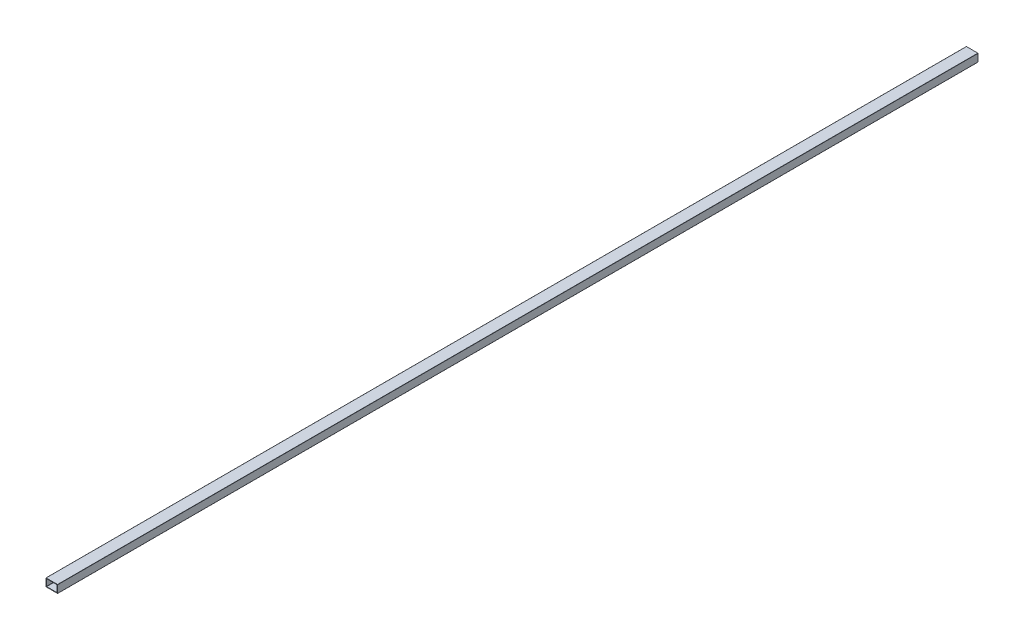
ISO-10303-21;
HEADER;
FILE_DESCRIPTION(('STEP AP214'),'2;1');
FILE_NAME('part.step','',(''),(''),'','','');
FILE_SCHEMA(('AUTOMOTIVE_DESIGN { 1 0 10303 214 1 1 1 1 }'));
ENDSEC;
DATA;
#1=APPLICATION_CONTEXT('core data for automotive mechanical design processes');
#2=APPLICATION_PROTOCOL_DEFINITION('international standard','automotive_design',2000,#1);
#3=PRODUCT_CONTEXT('',#1,'mechanical');
#4=PRODUCT('Part','Part','',(#3));
#5=PRODUCT_RELATED_PRODUCT_CATEGORY('part','',(#4));
#6=PRODUCT_DEFINITION_FORMATION('','',#4);
#7=PRODUCT_DEFINITION_CONTEXT('part definition',#1,'design');
#8=PRODUCT_DEFINITION('design','',#6,#7);
#9=PRODUCT_DEFINITION_SHAPE('','',#8);
#10=(LENGTH_UNIT() NAMED_UNIT(*) SI_UNIT(.MILLI.,.METRE.));
#11=(NAMED_UNIT(*) PLANE_ANGLE_UNIT() SI_UNIT($,.RADIAN.));
#12=(NAMED_UNIT(*) SI_UNIT($,.STERADIAN.) SOLID_ANGLE_UNIT());
#13=UNCERTAINTY_MEASURE_WITH_UNIT(LENGTH_MEASURE(1.E-05),#10,'distance_accuracy_value','');
#14=(GEOMETRIC_REPRESENTATION_CONTEXT(3) GLOBAL_UNCERTAINTY_ASSIGNED_CONTEXT((#13)) GLOBAL_UNIT_ASSIGNED_CONTEXT((#10,
#11,#12)) REPRESENTATION_CONTEXT('',''));
#15=CARTESIAN_POINT('',(0.,0.,0.));
#16=DIRECTION('',(0.,0.,1.));
#17=DIRECTION('',(1.,0.,0.));
#18=AXIS2_PLACEMENT_3D('',#15,#16,#17);
#19=CARTESIAN_POINT('',(38.1,-25.4,-6000.));
#20=DIRECTION('',(1.,0.,0.));
#21=DIRECTION('',(0.,0.,-1.));
#22=AXIS2_PLACEMENT_3D('',#19,#20,#21);
#23=PLANE('',#22);
#24=DIRECTION('',(0.,1.,0.));
#25=VECTOR('',#24,1.);
#26=CARTESIAN_POINT('',(38.1,-25.4,0.));
#27=LINE('',#26,#25);
#28=CARTESIAN_POINT('',(38.1,-24.4,0.));
#29=VERTEX_POINT('',#28);
#30=CARTESIAN_POINT('',(38.1,24.4,0.));
#31=VERTEX_POINT('',#30);
#32=EDGE_CURVE('E197',#29,#31,#27,.T.);
#33=ORIENTED_EDGE('',*,*,#32,.F.);
#34=DIRECTION('',(0.,0.,1.));
#35=VECTOR('',#34,1.);
#36=CARTESIAN_POINT('',(38.1,-24.4,-6000.));
#37=LINE('',#36,#35);
#38=CARTESIAN_POINT('',(38.1,-24.4,-6000.));
#39=VERTEX_POINT('',#38);
#40=EDGE_CURVE('E158',#29,#39,#37,.F.);
#41=ORIENTED_EDGE('',*,*,#40,.T.);
#42=DIRECTION('',(0.,1.,0.));
#43=VECTOR('',#42,1.);
#44=CARTESIAN_POINT('',(38.1,-25.4,-6000.));
#45=LINE('',#44,#43);
#46=CARTESIAN_POINT('',(38.1,24.4,-6000.));
#47=VERTEX_POINT('',#46);
#48=EDGE_CURVE('E185',#39,#47,#45,.T.);
#49=ORIENTED_EDGE('',*,*,#48,.T.);
#50=DIRECTION('',(0.,0.,1.));
#51=VECTOR('',#50,1.);
#52=CARTESIAN_POINT('',(38.1,24.4,-6000.));
#53=LINE('',#52,#51);
#54=EDGE_CURVE('E251',#47,#31,#53,.T.);
#55=ORIENTED_EDGE('',*,*,#54,.T.);
#56=EDGE_LOOP('',(#33,#41,#49,#55));
#57=FACE_BOUND('',#56,.T.);
#58=ADVANCED_FACE('F33',(#57),#23,.T.);
#59=CARTESIAN_POINT('',(-38.1,-25.4,-6000.));
#60=DIRECTION('',(0.,-1.,0.));
#61=DIRECTION('',(0.,0.,-1.));
#62=AXIS2_PLACEMENT_3D('',#59,#60,#61);
#63=PLANE('',#62);
#64=DIRECTION('',(1.,0.,0.));
#65=VECTOR('',#64,1.);
#66=CARTESIAN_POINT('',(-38.1,-25.4,0.));
#67=LINE('',#66,#65);
#68=CARTESIAN_POINT('',(-37.1,-25.4,0.));
#69=VERTEX_POINT('',#68);
#70=CARTESIAN_POINT('',(37.1,-25.4,0.));
#71=VERTEX_POINT('',#70);
#72=EDGE_CURVE('E189',#69,#71,#67,.T.);
#73=ORIENTED_EDGE('',*,*,#72,.F.);
#74=DIRECTION('',(0.,0.,1.));
#75=VECTOR('',#74,1.);
#76=CARTESIAN_POINT('',(-37.1,-25.4,-6000.));
#77=LINE('',#76,#75);
#78=CARTESIAN_POINT('',(-37.1,-25.4,-6000.));
#79=VERTEX_POINT('',#78);
#80=EDGE_CURVE('E238',#69,#79,#77,.F.);
#81=ORIENTED_EDGE('',*,*,#80,.T.);
#82=DIRECTION('',(1.,0.,0.));
#83=VECTOR('',#82,1.);
#84=CARTESIAN_POINT('',(-38.1,-25.4,-6000.));
#85=LINE('',#84,#83);
#86=CARTESIAN_POINT('',(37.1,-25.4,-6000.));
#87=VERTEX_POINT('',#86);
#88=EDGE_CURVE('E194',#79,#87,#85,.T.);
#89=ORIENTED_EDGE('',*,*,#88,.T.);
#90=DIRECTION('',(0.,0.,1.));
#91=VECTOR('',#90,1.);
#92=CARTESIAN_POINT('',(37.1,-25.4,-6000.));
#93=LINE('',#92,#91);
#94=EDGE_CURVE('E235',#87,#71,#93,.T.);
#95=ORIENTED_EDGE('',*,*,#94,.T.);
#96=EDGE_LOOP('',(#73,#81,#89,#95));
#97=FACE_BOUND('',#96,.T.);
#98=ADVANCED_FACE('F305',(#97),#63,.T.);
#99=CARTESIAN_POINT('',(-38.1,-25.4,-6000.));
#100=DIRECTION('',(-1.,0.,0.));
#101=DIRECTION('',(0.,0.,1.));
#102=AXIS2_PLACEMENT_3D('',#99,#100,#101);
#103=PLANE('',#102);
#104=DIRECTION('',(0.,-1.,0.));
#105=VECTOR('',#104,1.);
#106=CARTESIAN_POINT('',(-38.1,-25.4,-6000.));
#107=LINE('',#106,#105);
#108=CARTESIAN_POINT('',(-38.1,24.4,-6000.));
#109=VERTEX_POINT('',#108);
#110=CARTESIAN_POINT('',(-38.1,-24.4,-6000.));
#111=VERTEX_POINT('',#110);
#112=EDGE_CURVE('E191',#109,#111,#107,.T.);
#113=ORIENTED_EDGE('',*,*,#112,.T.);
#114=DIRECTION('',(0.,0.,1.));
#115=VECTOR('',#114,1.);
#116=CARTESIAN_POINT('',(-38.1,-24.4,-6000.));
#117=LINE('',#116,#115);
#118=CARTESIAN_POINT('',(-38.1,-24.4,0.));
#119=VERTEX_POINT('',#118);
#120=EDGE_CURVE('E224',#111,#119,#117,.T.);
#121=ORIENTED_EDGE('',*,*,#120,.T.);
#122=DIRECTION('',(0.,-1.,0.));
#123=VECTOR('',#122,1.);
#124=CARTESIAN_POINT('',(-38.1,-25.4,0.));
#125=LINE('',#124,#123);
#126=CARTESIAN_POINT('',(-38.1,24.4,0.));
#127=VERTEX_POINT('',#126);
#128=EDGE_CURVE('E203',#127,#119,#125,.T.);
#129=ORIENTED_EDGE('',*,*,#128,.F.);
#130=DIRECTION('',(0.,0.,1.));
#131=VECTOR('',#130,1.);
#132=CARTESIAN_POINT('',(-38.1,24.4,-6000.));
#133=LINE('',#132,#131);
#134=EDGE_CURVE('E222',#127,#109,#133,.F.);
#135=ORIENTED_EDGE('',*,*,#134,.T.);
#136=EDGE_LOOP('',(#113,#121,#129,#135));
#137=FACE_BOUND('',#136,.T.);
#138=ADVANCED_FACE('F311',(#137),#103,.T.);
#139=CARTESIAN_POINT('',(-38.1,25.4,-6000.));
#140=DIRECTION('',(0.,1.,0.));
#141=DIRECTION('',(0.,0.,1.));
#142=AXIS2_PLACEMENT_3D('',#139,#140,#141);
#143=PLANE('',#142);
#144=DIRECTION('',(-1.,0.,0.));
#145=VECTOR('',#144,1.);
#146=CARTESIAN_POINT('',(-38.1,25.4,-6000.));
#147=LINE('',#146,#145);
#148=CARTESIAN_POINT('',(37.1,25.4,-6000.));
#149=VERTEX_POINT('',#148);
#150=CARTESIAN_POINT('',(-37.1,25.4,-6000.));
#151=VERTEX_POINT('',#150);
#152=EDGE_CURVE('E188',#149,#151,#147,.T.);
#153=ORIENTED_EDGE('',*,*,#152,.T.);
#154=DIRECTION('',(0.,0.,1.));
#155=VECTOR('',#154,1.);
#156=CARTESIAN_POINT('',(-37.1,25.4,-6000.));
#157=LINE('',#156,#155);
#158=CARTESIAN_POINT('',(-37.1,25.4,0.));
#159=VERTEX_POINT('',#158);
#160=EDGE_CURVE('E248',#151,#159,#157,.T.);
#161=ORIENTED_EDGE('',*,*,#160,.T.);
#162=DIRECTION('',(-1.,0.,0.));
#163=VECTOR('',#162,1.);
#164=CARTESIAN_POINT('',(-38.1,25.4,0.));
#165=LINE('',#164,#163);
#166=CARTESIAN_POINT('',(37.1,25.4,0.));
#167=VERTEX_POINT('',#166);
#168=EDGE_CURVE('E200',#167,#159,#165,.T.);
#169=ORIENTED_EDGE('',*,*,#168,.F.);
#170=DIRECTION('',(0.,0.,1.));
#171=VECTOR('',#170,1.);
#172=CARTESIAN_POINT('',(37.1,25.4,-6000.));
#173=LINE('',#172,#171);
#174=EDGE_CURVE('E55',#167,#149,#173,.F.);
#175=ORIENTED_EDGE('',*,*,#174,.T.);
#176=EDGE_LOOP('',(#153,#161,#169,#175));
#177=FACE_BOUND('',#176,.T.);
#178=ADVANCED_FACE('F316',(#177),#143,.T.);
#179=CARTESIAN_POINT('',(0.,0.,-6000.));
#180=DIRECTION('',(0.,0.,-1.));
#181=DIRECTION('',(-1.,0.,0.));
#182=AXIS2_PLACEMENT_3D('',#179,#180,#181);
#183=PLANE('',#182);
#184=DIRECTION('',(0.,-1.,0.));
#185=VECTOR('',#184,1.);
#186=CARTESIAN_POINT('',(-35.06,-22.36,-6000.));
#187=LINE('',#186,#185);
#188=CARTESIAN_POINT('',(-35.06,21.36,-6000.));
#189=VERTEX_POINT('',#188);
#190=CARTESIAN_POINT('',(-35.06,-21.36,-6000.));
#191=VERTEX_POINT('',#190);
#192=EDGE_CURVE('E167',#189,#191,#187,.T.);
#193=ORIENTED_EDGE('',*,*,#192,.T.);
#194=CARTESIAN_POINT('',(-34.06,-21.36,-6000.));
#195=DIRECTION('',(0.,0.,-1.));
#196=DIRECTION('',(-1.,0.,0.));
#197=AXIS2_PLACEMENT_3D('',#194,#195,#196);
#198=CIRCLE('',#197,1.);
#199=CARTESIAN_POINT('',(-34.06,-22.36,-6000.));
#200=VERTEX_POINT('',#199);
#201=EDGE_CURVE('E11',#191,#200,#198,.F.);
#202=ORIENTED_EDGE('',*,*,#201,.T.);
#203=DIRECTION('',(1.,0.,0.));
#204=VECTOR('',#203,1.);
#205=CARTESIAN_POINT('',(-35.06,-22.36,-6000.));
#206=LINE('',#205,#204);
#207=CARTESIAN_POINT('',(34.06,-22.36,-6000.));
#208=VERTEX_POINT('',#207);
#209=EDGE_CURVE('E175',#200,#208,#206,.T.);
#210=ORIENTED_EDGE('',*,*,#209,.T.);
#211=CARTESIAN_POINT('',(34.06,-21.36,-6000.));
#212=DIRECTION('',(0.,0.,-1.));
#213=DIRECTION('',(-1.,0.,0.));
#214=AXIS2_PLACEMENT_3D('',#211,#212,#213);
#215=CIRCLE('',#214,1.);
#216=CARTESIAN_POINT('',(35.06,-21.36,-6000.));
#217=VERTEX_POINT('',#216);
#218=EDGE_CURVE('E262',#208,#217,#215,.F.);
#219=ORIENTED_EDGE('',*,*,#218,.T.);
#220=DIRECTION('',(0.,1.,0.));
#221=VECTOR('',#220,1.);
#222=CARTESIAN_POINT('',(35.06,-22.36,-6000.));
#223=LINE('',#222,#221);
#224=CARTESIAN_POINT('',(35.06,21.36,-6000.));
#225=VERTEX_POINT('',#224);
#226=EDGE_CURVE('E179',#217,#225,#223,.T.);
#227=ORIENTED_EDGE('',*,*,#226,.T.);
#228=CARTESIAN_POINT('',(34.06,21.36,-6000.));
#229=DIRECTION('',(0.,0.,-1.));
#230=DIRECTION('',(-1.,0.,0.));
#231=AXIS2_PLACEMENT_3D('',#228,#229,#230);
#232=CIRCLE('',#231,1.);
#233=CARTESIAN_POINT('',(34.06,22.36,-6000.));
#234=VERTEX_POINT('',#233);
#235=EDGE_CURVE('E258',#225,#234,#232,.F.);
#236=ORIENTED_EDGE('',*,*,#235,.T.);
#237=DIRECTION('',(-1.,0.,0.));
#238=VECTOR('',#237,1.);
#239=CARTESIAN_POINT('',(-35.06,22.36,-6000.));
#240=LINE('',#239,#238);
#241=CARTESIAN_POINT('',(-34.06,22.36,-6000.));
#242=VERTEX_POINT('',#241);
#243=EDGE_CURVE('E277',#234,#242,#240,.T.);
#244=ORIENTED_EDGE('',*,*,#243,.T.);
#245=CARTESIAN_POINT('',(-34.06,21.36,-6000.));
#246=DIRECTION('',(0.,0.,-1.));
#247=DIRECTION('',(-1.,0.,0.));
#248=AXIS2_PLACEMENT_3D('',#245,#246,#247);
#249=CIRCLE('',#248,1.);
#250=EDGE_CURVE('E157',#242,#189,#249,.F.);
#251=ORIENTED_EDGE('',*,*,#250,.T.);
#252=EDGE_LOOP('',(#193,#202,#210,#219,#227,#236,#244,#251));
#253=FACE_BOUND('',#252,.T.);
#254=ORIENTED_EDGE('',*,*,#88,.F.);
#255=CARTESIAN_POINT('',(-37.1,-24.4,-6000.));
#256=DIRECTION('',(0.,0.,-1.));
#257=DIRECTION('',(-1.,0.,0.));
#258=AXIS2_PLACEMENT_3D('',#255,#256,#257);
#259=CIRCLE('',#258,1.);
#260=EDGE_CURVE('E245',#79,#111,#259,.T.);
#261=ORIENTED_EDGE('',*,*,#260,.T.);
#262=ORIENTED_EDGE('',*,*,#112,.F.);
#263=CARTESIAN_POINT('',(-37.1,24.4,-6000.));
#264=DIRECTION('',(0.,0.,-1.));
#265=DIRECTION('',(-1.,0.,0.));
#266=AXIS2_PLACEMENT_3D('',#263,#264,#265);
#267=CIRCLE('',#266,1.);
#268=EDGE_CURVE('E48',#109,#151,#267,.T.);
#269=ORIENTED_EDGE('',*,*,#268,.T.);
#270=ORIENTED_EDGE('',*,*,#152,.F.);
#271=CARTESIAN_POINT('',(37.1,24.4,-6000.));
#272=DIRECTION('',(0.,0.,-1.));
#273=DIRECTION('',(-1.,0.,0.));
#274=AXIS2_PLACEMENT_3D('',#271,#272,#273);
#275=CIRCLE('',#274,1.);
#276=EDGE_CURVE('E240',#149,#47,#275,.T.);
#277=ORIENTED_EDGE('',*,*,#276,.T.);
#278=ORIENTED_EDGE('',*,*,#48,.F.);
#279=CARTESIAN_POINT('',(37.1,-24.4,-6000.));
#280=DIRECTION('',(0.,0.,-1.));
#281=DIRECTION('',(-1.,0.,0.));
#282=AXIS2_PLACEMENT_3D('',#279,#280,#281);
#283=CIRCLE('',#282,1.);
#284=EDGE_CURVE('E242',#39,#87,#283,.T.);
#285=ORIENTED_EDGE('',*,*,#284,.T.);
#286=EDGE_LOOP('',(#254,#261,#262,#269,#270,#277,#278,#285));
#287=FACE_BOUND('',#286,.T.);
#288=ADVANCED_FACE('F267',(#253,#287),#183,.T.);
#289=CARTESIAN_POINT('',(0.,0.,0.));
#290=DIRECTION('',(0.,0.,-1.));
#291=DIRECTION('',(-1.,0.,0.));
#292=AXIS2_PLACEMENT_3D('',#289,#290,#291);
#293=PLANE('',#292);
#294=DIRECTION('',(0.,1.,0.));
#295=VECTOR('',#294,1.);
#296=CARTESIAN_POINT('',(35.06,-22.36,0.));
#297=LINE('',#296,#295);
#298=CARTESIAN_POINT('',(35.06,-21.36,0.));
#299=VERTEX_POINT('',#298);
#300=CARTESIAN_POINT('',(35.06,21.36,0.));
#301=VERTEX_POINT('',#300);
#302=EDGE_CURVE('E181',#299,#301,#297,.T.);
#303=ORIENTED_EDGE('',*,*,#302,.F.);
#304=CARTESIAN_POINT('',(34.06,-21.36,0.));
#305=DIRECTION('',(0.,0.,-1.));
#306=DIRECTION('',(-1.,0.,0.));
#307=AXIS2_PLACEMENT_3D('',#304,#305,#306);
#308=CIRCLE('',#307,1.);
#309=CARTESIAN_POINT('',(34.06,-22.36,0.));
#310=VERTEX_POINT('',#309);
#311=EDGE_CURVE('E260',#299,#310,#308,.T.);
#312=ORIENTED_EDGE('',*,*,#311,.T.);
#313=DIRECTION('',(1.,0.,0.));
#314=VECTOR('',#313,1.);
#315=CARTESIAN_POINT('',(-35.06,-22.36,0.));
#316=LINE('',#315,#314);
#317=CARTESIAN_POINT('',(-34.06,-22.36,0.));
#318=VERTEX_POINT('',#317);
#319=EDGE_CURVE('E281',#318,#310,#316,.T.);
#320=ORIENTED_EDGE('',*,*,#319,.F.);
#321=CARTESIAN_POINT('',(-34.06,-21.36,0.));
#322=DIRECTION('',(0.,0.,-1.));
#323=DIRECTION('',(-1.,0.,0.));
#324=AXIS2_PLACEMENT_3D('',#321,#322,#323);
#325=CIRCLE('',#324,1.);
#326=CARTESIAN_POINT('',(-35.06,-21.36,0.));
#327=VERTEX_POINT('',#326);
#328=EDGE_CURVE('E41',#318,#327,#325,.T.);
#329=ORIENTED_EDGE('',*,*,#328,.T.);
#330=DIRECTION('',(0.,-1.,0.));
#331=VECTOR('',#330,1.);
#332=CARTESIAN_POINT('',(-35.06,-22.36,0.));
#333=LINE('',#332,#331);
#334=CARTESIAN_POINT('',(-35.06,21.36,0.));
#335=VERTEX_POINT('',#334);
#336=EDGE_CURVE('E164',#335,#327,#333,.T.);
#337=ORIENTED_EDGE('',*,*,#336,.F.);
#338=CARTESIAN_POINT('',(-34.06,21.36,0.));
#339=DIRECTION('',(0.,0.,-1.));
#340=DIRECTION('',(-1.,0.,0.));
#341=AXIS2_PLACEMENT_3D('',#338,#339,#340);
#342=CIRCLE('',#341,1.);
#343=CARTESIAN_POINT('',(-34.06,22.36,0.));
#344=VERTEX_POINT('',#343);
#345=EDGE_CURVE('E147',#335,#344,#342,.T.);
#346=ORIENTED_EDGE('',*,*,#345,.T.);
#347=DIRECTION('',(-1.,0.,0.));
#348=VECTOR('',#347,1.);
#349=CARTESIAN_POINT('',(-35.06,22.36,0.));
#350=LINE('',#349,#348);
#351=CARTESIAN_POINT('',(34.06,22.36,0.));
#352=VERTEX_POINT('',#351);
#353=EDGE_CURVE('E176',#352,#344,#350,.T.);
#354=ORIENTED_EDGE('',*,*,#353,.F.);
#355=CARTESIAN_POINT('',(34.06,21.36,0.));
#356=DIRECTION('',(0.,0.,-1.));
#357=DIRECTION('',(-1.,0.,0.));
#358=AXIS2_PLACEMENT_3D('',#355,#356,#357);
#359=CIRCLE('',#358,1.);
#360=EDGE_CURVE('E256',#352,#301,#359,.T.);
#361=ORIENTED_EDGE('',*,*,#360,.T.);
#362=EDGE_LOOP('',(#303,#312,#320,#329,#337,#346,#354,#361));
#363=FACE_BOUND('',#362,.T.);
#364=ORIENTED_EDGE('',*,*,#128,.T.);
#365=CARTESIAN_POINT('',(-37.1,-24.4,0.));
#366=DIRECTION('',(0.,0.,-1.));
#367=DIRECTION('',(-1.,0.,0.));
#368=AXIS2_PLACEMENT_3D('',#365,#366,#367);
#369=CIRCLE('',#368,1.);
#370=EDGE_CURVE('E233',#119,#69,#369,.F.);
#371=ORIENTED_EDGE('',*,*,#370,.T.);
#372=ORIENTED_EDGE('',*,*,#72,.T.);
#373=CARTESIAN_POINT('',(37.1,-24.4,0.));
#374=DIRECTION('',(0.,0.,-1.));
#375=DIRECTION('',(-1.,0.,0.));
#376=AXIS2_PLACEMENT_3D('',#373,#374,#375);
#377=CIRCLE('',#376,1.);
#378=EDGE_CURVE('E229',#71,#29,#377,.F.);
#379=ORIENTED_EDGE('',*,*,#378,.T.);
#380=ORIENTED_EDGE('',*,*,#32,.T.);
#381=CARTESIAN_POINT('',(37.1,24.4,0.));
#382=DIRECTION('',(0.,0.,-1.));
#383=DIRECTION('',(-1.,0.,0.));
#384=AXIS2_PLACEMENT_3D('',#381,#382,#383);
#385=CIRCLE('',#384,1.);
#386=EDGE_CURVE('E227',#31,#167,#385,.F.);
#387=ORIENTED_EDGE('',*,*,#386,.T.);
#388=ORIENTED_EDGE('',*,*,#168,.T.);
#389=CARTESIAN_POINT('',(-37.1,24.4,0.));
#390=DIRECTION('',(0.,0.,-1.));
#391=DIRECTION('',(-1.,0.,0.));
#392=AXIS2_PLACEMENT_3D('',#389,#390,#391);
#393=CIRCLE('',#392,1.);
#394=EDGE_CURVE('E231',#159,#127,#393,.F.);
#395=ORIENTED_EDGE('',*,*,#394,.T.);
#396=EDGE_LOOP('',(#364,#371,#372,#379,#380,#387,#388,#395));
#397=FACE_BOUND('',#396,.T.);
#398=ADVANCED_FACE('F172',(#363,#397),#293,.F.);
#399=CARTESIAN_POINT('',(-35.06,-22.36,-6000.));
#400=DIRECTION('',(0.,-1.,0.));
#401=DIRECTION('',(0.,0.,-1.));
#402=AXIS2_PLACEMENT_3D('',#399,#400,#401);
#403=PLANE('',#402);
#404=ORIENTED_EDGE('',*,*,#319,.T.);
#405=DIRECTION('',(0.,0.,1.));
#406=VECTOR('',#405,1.);
#407=CARTESIAN_POINT('',(34.06,-22.36,-6000.));
#408=LINE('',#407,#406);
#409=EDGE_CURVE('E220',#310,#208,#408,.F.);
#410=ORIENTED_EDGE('',*,*,#409,.T.);
#411=ORIENTED_EDGE('',*,*,#209,.F.);
#412=DIRECTION('',(0.,0.,1.));
#413=VECTOR('',#412,1.);
#414=CARTESIAN_POINT('',(-34.06,-22.36,0.));
#415=LINE('',#414,#413);
#416=EDGE_CURVE('E217',#200,#318,#415,.T.);
#417=ORIENTED_EDGE('',*,*,#416,.T.);
#418=EDGE_LOOP('',(#404,#410,#411,#417));
#419=FACE_BOUND('',#418,.T.);
#420=ADVANCED_FACE('F283',(#419),#403,.F.);
#421=CARTESIAN_POINT('',(-35.06,-22.36,-6000.));
#422=DIRECTION('',(-1.,0.,0.));
#423=DIRECTION('',(0.,0.,1.));
#424=AXIS2_PLACEMENT_3D('',#421,#422,#423);
#425=PLANE('',#424);
#426=ORIENTED_EDGE('',*,*,#192,.F.);
#427=DIRECTION('',(0.,0.,1.));
#428=VECTOR('',#427,1.);
#429=CARTESIAN_POINT('',(-35.06,21.36,0.));
#430=LINE('',#429,#428);
#431=EDGE_CURVE('E151',#189,#335,#430,.T.);
#432=ORIENTED_EDGE('',*,*,#431,.T.);
#433=ORIENTED_EDGE('',*,*,#336,.T.);
#434=DIRECTION('',(0.,0.,1.));
#435=VECTOR('',#434,1.);
#436=CARTESIAN_POINT('',(-35.06,-21.36,-6000.));
#437=LINE('',#436,#435);
#438=EDGE_CURVE('E169',#327,#191,#437,.F.);
#439=ORIENTED_EDGE('',*,*,#438,.T.);
#440=EDGE_LOOP('',(#426,#432,#433,#439));
#441=FACE_BOUND('',#440,.T.);
#442=ADVANCED_FACE('F163',(#441),#425,.F.);
#443=CARTESIAN_POINT('',(-35.06,22.36,-6000.));
#444=DIRECTION('',(0.,1.,0.));
#445=DIRECTION('',(-1.,0.,0.));
#446=AXIS2_PLACEMENT_3D('',#443,#444,#445);
#447=PLANE('',#446);
#448=ORIENTED_EDGE('',*,*,#353,.T.);
#449=DIRECTION('',(0.,0.,1.));
#450=VECTOR('',#449,1.);
#451=CARTESIAN_POINT('',(-34.06,22.36,-6000.));
#452=LINE('',#451,#450);
#453=EDGE_CURVE('E152',#344,#242,#452,.F.);
#454=ORIENTED_EDGE('',*,*,#453,.T.);
#455=ORIENTED_EDGE('',*,*,#243,.F.);
#456=DIRECTION('',(0.,0.,1.));
#457=VECTOR('',#456,1.);
#458=CARTESIAN_POINT('',(34.06,22.36,0.));
#459=LINE('',#458,#457);
#460=EDGE_CURVE('E168',#234,#352,#459,.T.);
#461=ORIENTED_EDGE('',*,*,#460,.T.);
#462=EDGE_LOOP('',(#448,#454,#455,#461));
#463=FACE_BOUND('',#462,.T.);
#464=ADVANCED_FACE('F292',(#463),#447,.F.);
#465=CARTESIAN_POINT('',(35.06,-22.36,-6000.));
#466=DIRECTION('',(1.,0.,0.));
#467=DIRECTION('',(0.,1.,0.));
#468=AXIS2_PLACEMENT_3D('',#465,#466,#467);
#469=PLANE('',#468);
#470=ORIENTED_EDGE('',*,*,#302,.T.);
#471=DIRECTION('',(0.,0.,1.));
#472=VECTOR('',#471,1.);
#473=CARTESIAN_POINT('',(35.06,21.36,-6000.));
#474=LINE('',#473,#472);
#475=EDGE_CURVE('E215',#301,#225,#474,.F.);
#476=ORIENTED_EDGE('',*,*,#475,.T.);
#477=ORIENTED_EDGE('',*,*,#226,.F.);
#478=DIRECTION('',(0.,0.,1.));
#479=VECTOR('',#478,1.);
#480=CARTESIAN_POINT('',(35.06,-21.36,0.));
#481=LINE('',#480,#479);
#482=EDGE_CURVE('E212',#217,#299,#481,.T.);
#483=ORIENTED_EDGE('',*,*,#482,.T.);
#484=EDGE_LOOP('',(#470,#476,#477,#483));
#485=FACE_BOUND('',#484,.T.);
#486=ADVANCED_FACE('F275',(#485),#469,.F.);
#487=CARTESIAN_POINT('',(-34.06,21.36,-6000.));
#488=DIRECTION('',(0.,0.,-1.));
#489=DIRECTION('',(-1.,0.,0.));
#490=AXIS2_PLACEMENT_3D('',#487,#488,#489);
#491=CYLINDRICAL_SURFACE('',#490,1.);
#492=ORIENTED_EDGE('',*,*,#250,.F.);
#493=ORIENTED_EDGE('',*,*,#453,.F.);
#494=ORIENTED_EDGE('',*,*,#345,.F.);
#495=ORIENTED_EDGE('',*,*,#431,.F.);
#496=EDGE_LOOP('',(#492,#493,#494,#495));
#497=FACE_BOUND('',#496,.T.);
#498=ADVANCED_FACE('F150',(#497),#491,.F.);
#499=CARTESIAN_POINT('',(34.06,21.36,-6000.));
#500=DIRECTION('',(0.,0.,-1.));
#501=DIRECTION('',(-1.,0.,0.));
#502=AXIS2_PLACEMENT_3D('',#499,#500,#501);
#503=CYLINDRICAL_SURFACE('',#502,1.);
#504=ORIENTED_EDGE('',*,*,#235,.F.);
#505=ORIENTED_EDGE('',*,*,#475,.F.);
#506=ORIENTED_EDGE('',*,*,#360,.F.);
#507=ORIENTED_EDGE('',*,*,#460,.F.);
#508=EDGE_LOOP('',(#504,#505,#506,#507));
#509=FACE_BOUND('',#508,.T.);
#510=ADVANCED_FACE('F294',(#509),#503,.F.);
#511=CARTESIAN_POINT('',(34.06,-21.36,-6000.));
#512=DIRECTION('',(0.,0.,-1.));
#513=DIRECTION('',(-1.,0.,0.));
#514=AXIS2_PLACEMENT_3D('',#511,#512,#513);
#515=CYLINDRICAL_SURFACE('',#514,1.);
#516=ORIENTED_EDGE('',*,*,#218,.F.);
#517=ORIENTED_EDGE('',*,*,#409,.F.);
#518=ORIENTED_EDGE('',*,*,#311,.F.);
#519=ORIENTED_EDGE('',*,*,#482,.F.);
#520=EDGE_LOOP('',(#516,#517,#518,#519));
#521=FACE_BOUND('',#520,.T.);
#522=ADVANCED_FACE('F279',(#521),#515,.F.);
#523=CARTESIAN_POINT('',(-37.1,-24.4,-6000.));
#524=DIRECTION('',(0.,0.,1.));
#525=DIRECTION('',(1.,0.,0.));
#526=AXIS2_PLACEMENT_3D('',#523,#524,#525);
#527=CYLINDRICAL_SURFACE('',#526,1.);
#528=ORIENTED_EDGE('',*,*,#260,.F.);
#529=ORIENTED_EDGE('',*,*,#80,.F.);
#530=ORIENTED_EDGE('',*,*,#370,.F.);
#531=ORIENTED_EDGE('',*,*,#120,.F.);
#532=EDGE_LOOP('',(#528,#529,#530,#531));
#533=FACE_BOUND('',#532,.T.);
#534=ADVANCED_FACE('F301',(#533),#527,.T.);
#535=CARTESIAN_POINT('',(-37.1,24.4,-6000.));
#536=DIRECTION('',(0.,0.,1.));
#537=DIRECTION('',(1.,0.,0.));
#538=AXIS2_PLACEMENT_3D('',#535,#536,#537);
#539=CYLINDRICAL_SURFACE('',#538,1.);
#540=ORIENTED_EDGE('',*,*,#268,.F.);
#541=ORIENTED_EDGE('',*,*,#134,.F.);
#542=ORIENTED_EDGE('',*,*,#394,.F.);
#543=ORIENTED_EDGE('',*,*,#160,.F.);
#544=EDGE_LOOP('',(#540,#541,#542,#543));
#545=FACE_BOUND('',#544,.T.);
#546=ADVANCED_FACE('F368',(#545),#539,.T.);
#547=CARTESIAN_POINT('',(-34.06,-21.36,-6000.));
#548=DIRECTION('',(0.,0.,-1.));
#549=DIRECTION('',(-1.,0.,0.));
#550=AXIS2_PLACEMENT_3D('',#547,#548,#549);
#551=CYLINDRICAL_SURFACE('',#550,1.);
#552=ORIENTED_EDGE('',*,*,#201,.F.);
#553=ORIENTED_EDGE('',*,*,#438,.F.);
#554=ORIENTED_EDGE('',*,*,#328,.F.);
#555=ORIENTED_EDGE('',*,*,#416,.F.);
#556=EDGE_LOOP('',(#552,#553,#554,#555));
#557=FACE_BOUND('',#556,.T.);
#558=ADVANCED_FACE('F378',(#557),#551,.F.);
#559=CARTESIAN_POINT('',(37.1,-24.4,-6000.));
#560=DIRECTION('',(0.,0.,1.));
#561=DIRECTION('',(1.,0.,0.));
#562=AXIS2_PLACEMENT_3D('',#559,#560,#561);
#563=CYLINDRICAL_SURFACE('',#562,1.);
#564=ORIENTED_EDGE('',*,*,#284,.F.);
#565=ORIENTED_EDGE('',*,*,#40,.F.);
#566=ORIENTED_EDGE('',*,*,#378,.F.);
#567=ORIENTED_EDGE('',*,*,#94,.F.);
#568=EDGE_LOOP('',(#564,#565,#566,#567));
#569=FACE_BOUND('',#568,.T.);
#570=ADVANCED_FACE('F388',(#569),#563,.T.);
#571=CARTESIAN_POINT('',(37.1,24.4,-6000.));
#572=DIRECTION('',(0.,0.,1.));
#573=DIRECTION('',(1.,0.,0.));
#574=AXIS2_PLACEMENT_3D('',#571,#572,#573);
#575=CYLINDRICAL_SURFACE('',#574,1.);
#576=ORIENTED_EDGE('',*,*,#276,.F.);
#577=ORIENTED_EDGE('',*,*,#174,.F.);
#578=ORIENTED_EDGE('',*,*,#386,.F.);
#579=ORIENTED_EDGE('',*,*,#54,.F.);
#580=EDGE_LOOP('',(#576,#577,#578,#579));
#581=FACE_BOUND('',#580,.T.);
#582=ADVANCED_FACE('F35',(#581),#575,.T.);
#583=CLOSED_SHELL('',(#58,#98,#138,#178,#288,#398,#420,#442,#464,#486,#498,#510,#522,#534,#546,
#558,#570,#582));
#584=MANIFOLD_SOLID_BREP('B2',#583);
#585=ADVANCED_BREP_SHAPE_REPRESENTATION('',(#18,#584),#14);
#586=SHAPE_DEFINITION_REPRESENTATION(#9,#585);
ENDSEC;
END-ISO-10303-21;
